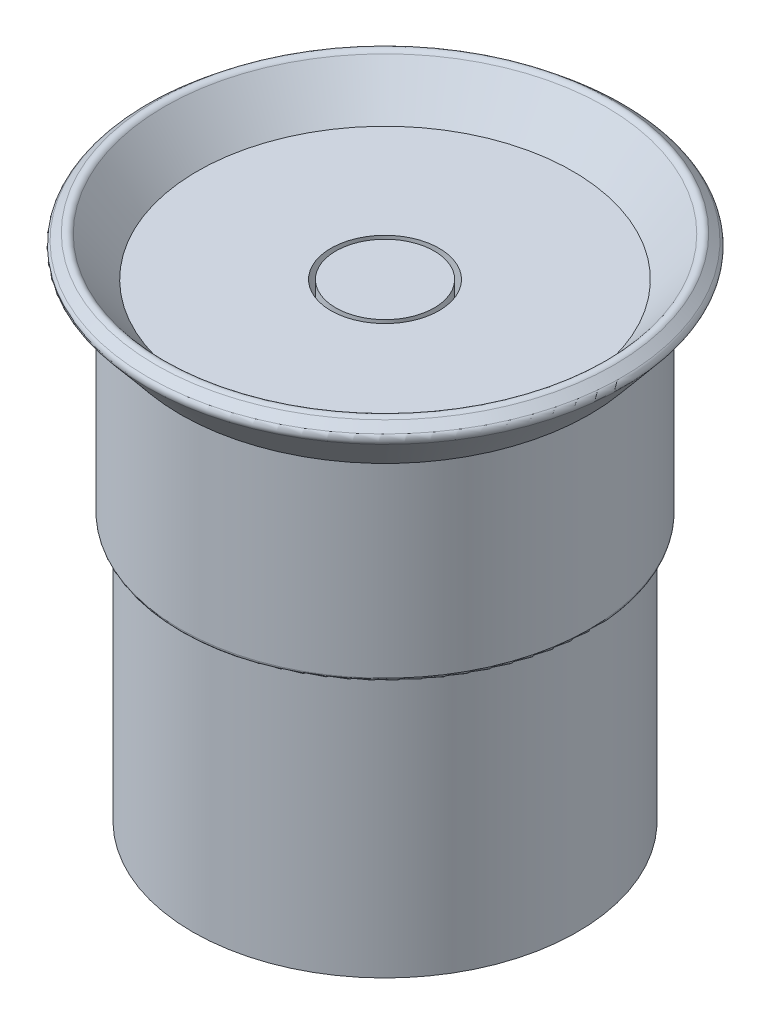
ISO-10303-21;
HEADER;
FILE_DESCRIPTION(('STEP AP214'),'2;1');
FILE_NAME('part.step','',(''),(''),'','','');
FILE_SCHEMA(('AUTOMOTIVE_DESIGN { 1 0 10303 214 1 1 1 1 }'));
ENDSEC;
DATA;
#1=APPLICATION_CONTEXT('core data for automotive mechanical design processes');
#2=APPLICATION_PROTOCOL_DEFINITION('international standard','automotive_design',2000,#1);
#3=PRODUCT_CONTEXT('',#1,'mechanical');
#4=PRODUCT('Part','Part','',(#3));
#5=PRODUCT_RELATED_PRODUCT_CATEGORY('part','',(#4));
#6=PRODUCT_DEFINITION_FORMATION('','',#4);
#7=PRODUCT_DEFINITION_CONTEXT('part definition',#1,'design');
#8=PRODUCT_DEFINITION('design','',#6,#7);
#9=PRODUCT_DEFINITION_SHAPE('','',#8);
#10=(LENGTH_UNIT() NAMED_UNIT(*) SI_UNIT(.MILLI.,.METRE.));
#11=(NAMED_UNIT(*) PLANE_ANGLE_UNIT() SI_UNIT($,.RADIAN.));
#12=(NAMED_UNIT(*) SI_UNIT($,.STERADIAN.) SOLID_ANGLE_UNIT());
#13=UNCERTAINTY_MEASURE_WITH_UNIT(LENGTH_MEASURE(1.E-05),#10,'distance_accuracy_value','');
#14=(GEOMETRIC_REPRESENTATION_CONTEXT(3) GLOBAL_UNCERTAINTY_ASSIGNED_CONTEXT((#13)) GLOBAL_UNIT_ASSIGNED_CONTEXT((#10,
#11,#12)) REPRESENTATION_CONTEXT('',''));
#15=CARTESIAN_POINT('',(0.,0.,0.));
#16=DIRECTION('',(0.,0.,1.));
#17=DIRECTION('',(1.,0.,0.));
#18=AXIS2_PLACEMENT_3D('',#15,#16,#17);
#19=CARTESIAN_POINT('',(0.,36.,0.));
#20=DIRECTION('',(0.,1.,0.));
#21=DIRECTION('',(0.,0.,1.));
#22=AXIS2_PLACEMENT_3D('',#19,#20,#21);
#23=CYLINDRICAL_SURFACE('',#22,4.09537815556507);
#24=CARTESIAN_POINT('',(0.,36.,0.));
#25=DIRECTION('',(0.,1.,0.));
#26=DIRECTION('',(0.,0.,1.));
#27=AXIS2_PLACEMENT_3D('',#24,#25,#26);
#28=CIRCLE('',#27,4.09537815556507);
#29=CARTESIAN_POINT('',(0.,36.,4.09537815556507));
#30=VERTEX_POINT('',#29);
#31=EDGE_CURVE('E11',#30,#30,#28,.T.);
#32=ORIENTED_EDGE('',*,*,#31,.T.);
#33=EDGE_LOOP('',(#32));
#34=FACE_BOUND('',#33,.T.);
#35=CARTESIAN_POINT('',(0.,39.,0.));
#36=DIRECTION('',(0.,1.,0.));
#37=DIRECTION('',(0.,0.,1.));
#38=AXIS2_PLACEMENT_3D('',#35,#36,#37);
#39=CIRCLE('',#38,4.09537815556507);
#40=CARTESIAN_POINT('',(0.,39.,4.09537815556507));
#41=VERTEX_POINT('',#40);
#42=EDGE_CURVE('E44',#41,#41,#39,.T.);
#43=ORIENTED_EDGE('',*,*,#42,.F.);
#44=EDGE_LOOP('',(#43));
#45=FACE_BOUND('',#44,.T.);
#46=ADVANCED_FACE('F41',(#34,#45),#23,.T.);
#47=CARTESIAN_POINT('',(0.,36.,0.));
#48=DIRECTION('',(0.,1.,0.));
#49=DIRECTION('',(0.,0.,1.));
#50=AXIS2_PLACEMENT_3D('',#47,#48,#49);
#51=PLANE('',#50);
#52=ORIENTED_EDGE('',*,*,#31,.F.);
#53=EDGE_LOOP('',(#52));
#54=FACE_BOUND('',#53,.T.);
#55=ADVANCED_FACE('F56',(#54),#51,.F.);
#56=CARTESIAN_POINT('',(0.,39.,0.));
#57=DIRECTION('',(0.,1.,0.));
#58=DIRECTION('',(0.,0.,1.));
#59=AXIS2_PLACEMENT_3D('',#56,#57,#58);
#60=PLANE('',#59);
#61=ORIENTED_EDGE('',*,*,#42,.T.);
#62=EDGE_LOOP('',(#61));
#63=FACE_BOUND('',#62,.T.);
#64=ADVANCED_FACE('F53',(#63),#60,.T.);
#65=CLOSED_SHELL('',(#46,#55,#64));
#66=MANIFOLD_SOLID_BREP('B2',#65);
#67=CARTESIAN_POINT('',(0.,39.,0.));
#68=DIRECTION('',(0.,1.,0.));
#69=DIRECTION('',(0.,0.,1.));
#70=AXIS2_PLACEMENT_3D('',#67,#68,#69);
#71=PLANE('',#70);
#72=CARTESIAN_POINT('',(0.,39.,0.));
#73=DIRECTION('',(0.,1.,0.));
#74=DIRECTION('',(0.,0.,1.));
#75=AXIS2_PLACEMENT_3D('',#72,#73,#74);
#76=CIRCLE('',#75,4.5);
#77=CARTESIAN_POINT('',(0.,39.,4.5));
#78=VERTEX_POINT('',#77);
#79=EDGE_CURVE('E126',#78,#78,#76,.T.);
#80=ORIENTED_EDGE('',*,*,#79,.F.);
#81=EDGE_LOOP('',(#80));
#82=FACE_BOUND('',#81,.T.);
#83=CARTESIAN_POINT('',(0.,39.,0.));
#84=DIRECTION('',(0.,1.,0.));
#85=DIRECTION('',(0.,0.,1.));
#86=AXIS2_PLACEMENT_3D('',#83,#84,#85);
#87=CIRCLE('',#86,15.6062870277007);
#88=CARTESIAN_POINT('',(0.,39.,15.6062870277007));
#89=VERTEX_POINT('',#88);
#90=EDGE_CURVE('E102',#89,#89,#87,.F.);
#91=ORIENTED_EDGE('',*,*,#90,.F.);
#92=EDGE_LOOP('',(#91));
#93=FACE_BOUND('',#92,.T.);
#94=ADVANCED_FACE('F82',(#82,#93),#71,.T.);
#95=CARTESIAN_POINT('',(0.,0.,0.));
#96=DIRECTION('',(0.,1.,0.));
#97=DIRECTION('',(0.,0.,1.));
#98=AXIS2_PLACEMENT_3D('',#95,#96,#97);
#99=PLANE('',#98);
#100=CARTESIAN_POINT('',(0.,0.,0.));
#101=DIRECTION('',(0.,1.,0.));
#102=DIRECTION('',(0.,0.,1.));
#103=AXIS2_PLACEMENT_3D('',#100,#101,#102);
#104=CIRCLE('',#103,16.);
#105=CARTESIAN_POINT('',(0.,0.,16.));
#106=VERTEX_POINT('',#105);
#107=EDGE_CURVE('E112',#106,#106,#104,.T.);
#108=ORIENTED_EDGE('',*,*,#107,.F.);
#109=EDGE_LOOP('',(#108));
#110=FACE_BOUND('',#109,.T.);
#111=CARTESIAN_POINT('',(0.,0.,0.));
#112=DIRECTION('',(0.,1.,0.));
#113=DIRECTION('',(0.,0.,1.));
#114=AXIS2_PLACEMENT_3D('',#111,#112,#113);
#115=CIRCLE('',#114,14.);
#116=CARTESIAN_POINT('',(0.,0.,14.));
#117=VERTEX_POINT('',#116);
#118=EDGE_CURVE('E115',#117,#117,#115,.T.);
#119=ORIENTED_EDGE('',*,*,#118,.T.);
#120=EDGE_LOOP('',(#119));
#121=FACE_BOUND('',#120,.T.);
#122=ADVANCED_FACE('F150',(#110,#121),#99,.F.);
#123=CARTESIAN_POINT('',(0.,22.,0.));
#124=DIRECTION('',(0.,-1.,0.));
#125=DIRECTION('',(0.,0.,-1.));
#126=AXIS2_PLACEMENT_3D('',#123,#124,#125);
#127=CYLINDRICAL_SURFACE('',#126,16.);
#128=CARTESIAN_POINT('',(0.,22.,0.));
#129=DIRECTION('',(0.,1.,0.));
#130=DIRECTION('',(0.,0.,1.));
#131=AXIS2_PLACEMENT_3D('',#128,#129,#130);
#132=CIRCLE('',#131,16.);
#133=CARTESIAN_POINT('',(0.,22.,16.));
#134=VERTEX_POINT('',#133);
#135=EDGE_CURVE('E111',#134,#134,#132,.T.);
#136=ORIENTED_EDGE('',*,*,#135,.F.);
#137=EDGE_LOOP('',(#136));
#138=FACE_BOUND('',#137,.T.);
#139=ORIENTED_EDGE('',*,*,#107,.T.);
#140=EDGE_LOOP('',(#139));
#141=FACE_BOUND('',#140,.T.);
#142=ADVANCED_FACE('F156',(#138,#141),#127,.T.);
#143=CARTESIAN_POINT('',(0.,22.,0.));
#144=DIRECTION('',(0.,-1.,0.));
#145=DIRECTION('',(0.,0.,-1.));
#146=AXIS2_PLACEMENT_3D('',#143,#144,#145);
#147=CYLINDRICAL_SURFACE('',#146,14.);
#148=CARTESIAN_POINT('',(0.,22.,0.));
#149=DIRECTION('',(0.,1.,0.));
#150=DIRECTION('',(0.,0.,1.));
#151=AXIS2_PLACEMENT_3D('',#148,#149,#150);
#152=CIRCLE('',#151,14.);
#153=CARTESIAN_POINT('',(0.,22.,14.));
#154=VERTEX_POINT('',#153);
#155=EDGE_CURVE('E120',#154,#154,#152,.T.);
#156=ORIENTED_EDGE('',*,*,#155,.T.);
#157=EDGE_LOOP('',(#156));
#158=FACE_BOUND('',#157,.T.);
#159=ORIENTED_EDGE('',*,*,#118,.F.);
#160=EDGE_LOOP('',(#159));
#161=FACE_BOUND('',#160,.T.);
#162=ADVANCED_FACE('F172',(#158,#161),#147,.F.);
#163=CARTESIAN_POINT('',(0.,22.,0.));
#164=DIRECTION('',(0.,1.,0.));
#165=DIRECTION('',(0.,0.,1.));
#166=AXIS2_PLACEMENT_3D('',#163,#164,#165);
#167=PLANE('',#166);
#168=CARTESIAN_POINT('',(0.,22.,0.));
#169=DIRECTION('',(0.,1.,0.));
#170=DIRECTION('',(0.,0.,1.));
#171=AXIS2_PLACEMENT_3D('',#168,#169,#170);
#172=CIRCLE('',#171,4.5);
#173=CARTESIAN_POINT('',(0.,22.,4.5));
#174=VERTEX_POINT('',#173);
#175=EDGE_CURVE('E123',#174,#174,#172,.T.);
#176=ORIENTED_EDGE('',*,*,#175,.T.);
#177=EDGE_LOOP('',(#176));
#178=FACE_BOUND('',#177,.T.);
#179=ORIENTED_EDGE('',*,*,#155,.F.);
#180=EDGE_LOOP('',(#179));
#181=FACE_BOUND('',#180,.T.);
#182=ADVANCED_FACE('F169',(#178,#181),#167,.F.);
#183=CARTESIAN_POINT('',(0.,39.,0.));
#184=DIRECTION('',(0.,-1.,0.));
#185=DIRECTION('',(0.,0.,-1.));
#186=AXIS2_PLACEMENT_3D('',#183,#184,#185);
#187=CYLINDRICAL_SURFACE('',#186,17.);
#188=CARTESIAN_POINT('',(0.,37.7643503063706,0.));
#189=DIRECTION('',(0.,-1.,0.));
#190=DIRECTION('',(0.,0.,-1.));
#191=AXIS2_PLACEMENT_3D('',#188,#189,#190);
#192=CIRCLE('',#191,17.);
#193=CARTESIAN_POINT('',(0.,37.7643503063706,-17.));
#194=VERTEX_POINT('',#193);
#195=EDGE_CURVE('E129',#194,#194,#192,.T.);
#196=ORIENTED_EDGE('',*,*,#195,.T.);
#197=EDGE_LOOP('',(#196));
#198=FACE_BOUND('',#197,.T.);
#199=CARTESIAN_POINT('',(0.,22.3,0.));
#200=DIRECTION('',(0.,1.,0.));
#201=DIRECTION('',(0.,0.,1.));
#202=AXIS2_PLACEMENT_3D('',#199,#200,#201);
#203=CIRCLE('',#202,17.);
#204=CARTESIAN_POINT('',(0.,22.3,17.));
#205=VERTEX_POINT('',#204);
#206=EDGE_CURVE('E108',#205,#205,#203,.T.);
#207=ORIENTED_EDGE('',*,*,#206,.T.);
#208=EDGE_LOOP('',(#207));
#209=FACE_BOUND('',#208,.T.);
#210=ADVANCED_FACE('F133',(#198,#209),#187,.T.);
#211=CARTESIAN_POINT('',(0.,22.,0.));
#212=DIRECTION('',(0.,1.,0.));
#213=DIRECTION('',(0.,0.,1.));
#214=AXIS2_PLACEMENT_3D('',#211,#212,#213);
#215=CIRCLE('',#214,16.7);
#216=CARTESIAN_POINT('',(0.,22.,16.7));
#217=VERTEX_POINT('',#216);
#218=EDGE_CURVE('E105',#217,#217,#215,.F.);
#219=ORIENTED_EDGE('',*,*,#218,.T.);
#220=EDGE_LOOP('',(#219));
#221=FACE_BOUND('',#220,.T.);
#222=ORIENTED_EDGE('',*,*,#135,.T.);
#223=EDGE_LOOP('',(#222));
#224=FACE_BOUND('',#223,.T.);
#225=ADVANCED_FACE('F165',(#221,#224),#167,.F.);
#226=CARTESIAN_POINT('',(0.,0.,0.));
#227=DIRECTION('',(0.,1.,0.));
#228=DIRECTION('',(0.,0.,1.));
#229=AXIS2_PLACEMENT_3D('',#226,#227,#228);
#230=CYLINDRICAL_SURFACE('',#229,4.5);
#231=ORIENTED_EDGE('',*,*,#79,.T.);
#232=EDGE_LOOP('',(#231));
#233=FACE_BOUND('',#232,.T.);
#234=ORIENTED_EDGE('',*,*,#175,.F.);
#235=EDGE_LOOP('',(#234));
#236=FACE_BOUND('',#235,.T.);
#237=ADVANCED_FACE('F163',(#233,#236),#230,.F.);
#238=CARTESIAN_POINT('',(0.,22.3,0.));
#239=DIRECTION('',(0.,1.,0.));
#240=DIRECTION('',(0.,0.,1.));
#241=AXIS2_PLACEMENT_3D('',#238,#239,#240);
#242=TOROIDAL_SURFACE('',#241,16.7,0.3);
#243=ORIENTED_EDGE('',*,*,#218,.F.);
#244=EDGE_LOOP('',(#243));
#245=FACE_BOUND('',#244,.T.);
#246=ORIENTED_EDGE('',*,*,#206,.F.);
#247=EDGE_LOOP('',(#246));
#248=FACE_BOUND('',#247,.T.);
#249=ADVANCED_FACE('F179',(#245,#248),#242,.T.);
#250=CARTESIAN_POINT('',(0.,42.6702017292464,0.));
#251=DIRECTION('',(0.,1.,0.));
#252=DIRECTION('',(0.,0.,1.));
#253=AXIS2_PLACEMENT_3D('',#250,#251,#252);
#254=CONICAL_SURFACE('',#253,18.6534765580992,0.69291657555299);
#255=CARTESIAN_POINT('',(0.,42.285508614957,0.));
#256=DIRECTION('',(0.,-1.,0.));
#257=DIRECTION('',(0.,0.,-1.));
#258=AXIS2_PLACEMENT_3D('',#255,#256,#257);
#259=CIRCLE('',#258,18.3340846236075);
#260=CARTESIAN_POINT('',(0.,42.285508614957,-18.3340846236075));
#261=VERTEX_POINT('',#260);
#262=EDGE_CURVE('E40',#261,#261,#259,.F.);
#263=ORIENTED_EDGE('',*,*,#262,.T.);
#264=EDGE_LOOP('',(#263));
#265=FACE_BOUND('',#264,.T.);
#266=ORIENTED_EDGE('',*,*,#90,.T.);
#267=EDGE_LOOP('',(#266));
#268=FACE_BOUND('',#267,.T.);
#269=ADVANCED_FACE('F147',(#265,#268),#254,.F.);
#270=CARTESIAN_POINT('',(0.,41.4810310369375,0.));
#271=DIRECTION('',(0.,-1.,0.));
#272=DIRECTION('',(0.,0.,-1.));
#273=AXIS2_PLACEMENT_3D('',#270,#271,#272);
#274=CONICAL_SURFACE('',#273,20.0857787787984,0.877879751241907);
#275=CARTESIAN_POINT('',(0.,41.8004229714293,0.));
#276=DIRECTION('',(0.,1.,0.));
#277=DIRECTION('',(0.,0.,1.));
#278=AXIS2_PLACEMENT_3D('',#275,#276,#277);
#279=CIRCLE('',#278,19.701085664509);
#280=CARTESIAN_POINT('',(0.,41.8004229714293,19.701085664509));
#281=VERTEX_POINT('',#280);
#282=EDGE_CURVE('E89',#281,#281,#279,.T.);
#283=ORIENTED_EDGE('',*,*,#282,.T.);
#284=EDGE_LOOP('',(#283));
#285=FACE_BOUND('',#284,.T.);
#286=CARTESIAN_POINT('',(0.,42.3508097947546,0.));
#287=DIRECTION('',(0.,1.,0.));
#288=DIRECTION('',(0.,0.,1.));
#289=AXIS2_PLACEMENT_3D('',#286,#287,#288);
#290=CIRCLE('',#289,19.0381696723886);
#291=CARTESIAN_POINT('',(0.,42.3508097947546,19.0381696723886));
#292=VERTEX_POINT('',#291);
#293=EDGE_CURVE('E93',#292,#292,#290,.F.);
#294=ORIENTED_EDGE('',*,*,#293,.T.);
#295=EDGE_LOOP('',(#294));
#296=FACE_BOUND('',#295,.T.);
#297=ADVANCED_FACE('F139',(#285,#296),#274,.T.);
#298=CARTESIAN_POINT('',(0.,37.7643503063706,0.));
#299=DIRECTION('',(0.,1.,0.));
#300=DIRECTION('',(0.,0.,1.));
#301=AXIS2_PLACEMENT_3D('',#298,#299,#300);
#302=CONICAL_SURFACE('',#301,17.,0.69291657555299);
#303=CARTESIAN_POINT('',(0.,41.0963379226482,0.));
#304=DIRECTION('',(0.,-1.,0.));
#305=DIRECTION('',(0.,0.,-1.));
#306=AXIS2_PLACEMENT_3D('',#303,#304,#305);
#307=CIRCLE('',#306,19.7663868443067);
#308=CARTESIAN_POINT('',(0.,41.0963379226482,-19.7663868443067));
#309=VERTEX_POINT('',#308);
#310=EDGE_CURVE('E97',#309,#309,#307,.T.);
#311=ORIENTED_EDGE('',*,*,#310,.T.);
#312=EDGE_LOOP('',(#311));
#313=FACE_BOUND('',#312,.T.);
#314=ORIENTED_EDGE('',*,*,#195,.F.);
#315=EDGE_LOOP('',(#314));
#316=FACE_BOUND('',#315,.T.);
#317=ADVANCED_FACE('F136',(#313,#316),#302,.T.);
#318=CARTESIAN_POINT('',(0.,41.4157298571399,0.));
#319=DIRECTION('',(0.,1.,0.));
#320=DIRECTION('',(0.,0.,1.));
#321=AXIS2_PLACEMENT_3D('',#318,#319,#320);
#322=TOROIDAL_SURFACE('',#321,19.3816937300173,0.5);
#323=ORIENTED_EDGE('',*,*,#282,.F.);
#324=EDGE_LOOP('',(#323));
#325=FACE_BOUND('',#324,.T.);
#326=ORIENTED_EDGE('',*,*,#310,.F.);
#327=EDGE_LOOP('',(#326));
#328=FACE_BOUND('',#327,.T.);
#329=ADVANCED_FACE('F138',(#325,#328),#322,.T.);
#330=CARTESIAN_POINT('',(0.,41.9661166804653,0.));
#331=DIRECTION('',(0.,1.,0.));
#332=DIRECTION('',(0.,0.,1.));
#333=AXIS2_PLACEMENT_3D('',#330,#331,#332);
#334=TOROIDAL_SURFACE('',#333,18.7187777378969,0.5);
#335=ORIENTED_EDGE('',*,*,#262,.F.);
#336=EDGE_LOOP('',(#335));
#337=FACE_BOUND('',#336,.T.);
#338=ORIENTED_EDGE('',*,*,#293,.F.);
#339=EDGE_LOOP('',(#338));
#340=FACE_BOUND('',#339,.T.);
#341=ADVANCED_FACE('F84',(#337,#340),#334,.T.);
#342=CLOSED_SHELL('',(#94,#122,#142,#162,#182,#210,#225,#237,#249,#269,#297,#317,#329,#341));
#343=MANIFOLD_SOLID_BREP('B6',#342);
#344=ADVANCED_BREP_SHAPE_REPRESENTATION('',(#18,#66,#343),#14);
#345=SHAPE_DEFINITION_REPRESENTATION(#9,#344);
ENDSEC;
END-ISO-10303-21;
